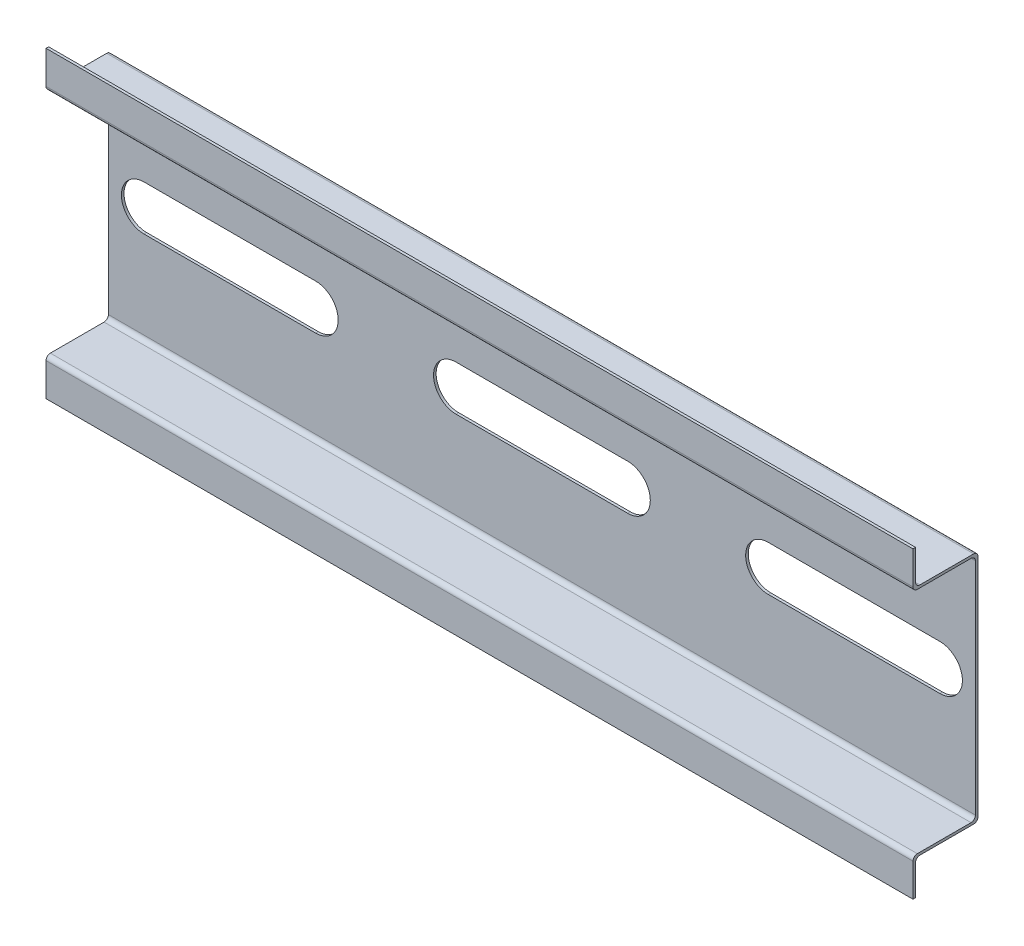
ISO-10303-21;
HEADER;
FILE_DESCRIPTION(('STEP AP214'),'2;1');
FILE_NAME('part.step','',(''),(''),'','','');
FILE_SCHEMA(('AUTOMOTIVE_DESIGN { 1 0 10303 214 1 1 1 1 }'));
ENDSEC;
DATA;
#1=APPLICATION_CONTEXT('core data for automotive mechanical design processes');
#2=APPLICATION_PROTOCOL_DEFINITION('international standard','automotive_design',2000,#1);
#3=PRODUCT_CONTEXT('',#1,'mechanical');
#4=PRODUCT('Part','Part','',(#3));
#5=PRODUCT_RELATED_PRODUCT_CATEGORY('part','',(#4));
#6=PRODUCT_DEFINITION_FORMATION('','',#4);
#7=PRODUCT_DEFINITION_CONTEXT('part definition',#1,'design');
#8=PRODUCT_DEFINITION('design','',#6,#7);
#9=PRODUCT_DEFINITION_SHAPE('','',#8);
#10=(LENGTH_UNIT() NAMED_UNIT(*) SI_UNIT(.MILLI.,.METRE.));
#11=(NAMED_UNIT(*) PLANE_ANGLE_UNIT() SI_UNIT($,.RADIAN.));
#12=(NAMED_UNIT(*) SI_UNIT($,.STERADIAN.) SOLID_ANGLE_UNIT());
#13=UNCERTAINTY_MEASURE_WITH_UNIT(LENGTH_MEASURE(1.E-05),#10,'distance_accuracy_value','');
#14=(GEOMETRIC_REPRESENTATION_CONTEXT(3) GLOBAL_UNCERTAINTY_ASSIGNED_CONTEXT((#13)) GLOBAL_UNIT_ASSIGNED_CONTEXT((#10,
#11,#12)) REPRESENTATION_CONTEXT('',''));
#15=CARTESIAN_POINT('',(0.,0.,0.));
#16=DIRECTION('',(0.,0.,1.));
#17=DIRECTION('',(1.,0.,0.));
#18=AXIS2_PLACEMENT_3D('',#15,#16,#17);
#19=CARTESIAN_POINT('',(100.,17.5,3.45));
#20=DIRECTION('',(0.,-1.,0.));
#21=DIRECTION('',(0.,0.,-1.));
#22=AXIS2_PLACEMENT_3D('',#19,#20,#21);
#23=PLANE('',#22);
#24=DIRECTION('',(0.,0.,1.));
#25=VECTOR('',#24,1.);
#26=CARTESIAN_POINT('',(0.,17.5,3.45));
#27=LINE('',#26,#25);
#28=CARTESIAN_POINT('',(0.,17.5,3.45));
#29=VERTEX_POINT('',#28);
#30=CARTESIAN_POINT('',(0.,17.5,3.75));
#31=VERTEX_POINT('',#30);
#32=EDGE_CURVE('E343',#29,#31,#27,.T.);
#33=ORIENTED_EDGE('',*,*,#32,.T.);
#34=DIRECTION('',(-1.,0.,0.));
#35=VECTOR('',#34,1.);
#36=CARTESIAN_POINT('',(100.,17.5,3.75));
#37=LINE('',#36,#35);
#38=CARTESIAN_POINT('',(100.,17.5,3.75));
#39=VERTEX_POINT('',#38);
#40=EDGE_CURVE('E11',#39,#31,#37,.T.);
#41=ORIENTED_EDGE('',*,*,#40,.F.);
#42=DIRECTION('',(0.,0.,1.));
#43=VECTOR('',#42,1.);
#44=CARTESIAN_POINT('',(100.,17.5,3.45));
#45=LINE('',#44,#43);
#46=CARTESIAN_POINT('',(100.,17.5,3.45));
#47=VERTEX_POINT('',#46);
#48=EDGE_CURVE('E344',#47,#39,#45,.T.);
#49=ORIENTED_EDGE('',*,*,#48,.F.);
#50=DIRECTION('',(-1.,0.,0.));
#51=VECTOR('',#50,1.);
#52=CARTESIAN_POINT('',(100.,17.5,3.45));
#53=LINE('',#52,#51);
#54=EDGE_CURVE('E386',#47,#29,#53,.T.);
#55=ORIENTED_EDGE('',*,*,#54,.T.);
#56=EDGE_LOOP('',(#33,#41,#49,#55));
#57=FACE_BOUND('',#56,.T.);
#58=ADVANCED_FACE('F33',(#57),#23,.F.);
#59=CARTESIAN_POINT('',(100.,17.5,3.75));
#60=DIRECTION('',(0.,0.,-1.));
#61=DIRECTION('',(0.,1.,0.));
#62=AXIS2_PLACEMENT_3D('',#59,#60,#61);
#63=PLANE('',#62);
#64=DIRECTION('',(0.,-1.,0.));
#65=VECTOR('',#64,1.);
#66=CARTESIAN_POINT('',(0.,17.5,3.75));
#67=LINE('',#66,#65);
#68=CARTESIAN_POINT('',(0.,13.7,3.75));
#69=VERTEX_POINT('',#68);
#70=EDGE_CURVE('E389',#31,#69,#67,.T.);
#71=ORIENTED_EDGE('',*,*,#70,.T.);
#72=DIRECTION('',(-1.,0.,0.));
#73=VECTOR('',#72,1.);
#74=CARTESIAN_POINT('',(100.,13.7,3.75));
#75=LINE('',#74,#73);
#76=CARTESIAN_POINT('',(100.,13.7,3.75));
#77=VERTEX_POINT('',#76);
#78=EDGE_CURVE('E40',#77,#69,#75,.T.);
#79=ORIENTED_EDGE('',*,*,#78,.F.);
#80=DIRECTION('',(0.,-1.,0.));
#81=VECTOR('',#80,1.);
#82=CARTESIAN_POINT('',(100.,17.5,3.75));
#83=LINE('',#82,#81);
#84=EDGE_CURVE('E347',#39,#77,#83,.T.);
#85=ORIENTED_EDGE('',*,*,#84,.F.);
#86=ORIENTED_EDGE('',*,*,#40,.T.);
#87=EDGE_LOOP('',(#71,#79,#85,#86));
#88=FACE_BOUND('',#87,.T.);
#89=ADVANCED_FACE('F506',(#88),#63,.F.);
#90=CARTESIAN_POINT('',(100.,13.7,3.25));
#91=DIRECTION('',(-1.,0.,0.));
#92=DIRECTION('',(0.,0.,1.));
#93=AXIS2_PLACEMENT_3D('',#90,#91,#92);
#94=CYLINDRICAL_SURFACE('',#93,0.5);
#95=CARTESIAN_POINT('',(0.,13.7,3.25));
#96=DIRECTION('',(1.,0.,0.));
#97=DIRECTION('',(0.,0.,-1.));
#98=AXIS2_PLACEMENT_3D('',#95,#96,#97);
#99=CIRCLE('',#98,0.5);
#100=CARTESIAN_POINT('',(0.,13.2,3.25));
#101=VERTEX_POINT('',#100);
#102=EDGE_CURVE('E391',#69,#101,#99,.T.);
#103=ORIENTED_EDGE('',*,*,#102,.T.);
#104=DIRECTION('',(-1.,0.,0.));
#105=VECTOR('',#104,1.);
#106=CARTESIAN_POINT('',(100.,13.2,3.25));
#107=LINE('',#106,#105);
#108=CARTESIAN_POINT('',(100.,13.2,3.25));
#109=VERTEX_POINT('',#108);
#110=EDGE_CURVE('E476',#109,#101,#107,.T.);
#111=ORIENTED_EDGE('',*,*,#110,.F.);
#112=CARTESIAN_POINT('',(100.,13.7,3.25));
#113=DIRECTION('',(1.,0.,0.));
#114=DIRECTION('',(0.,0.,-1.));
#115=AXIS2_PLACEMENT_3D('',#112,#113,#114);
#116=CIRCLE('',#115,0.5);
#117=EDGE_CURVE('E350',#77,#109,#116,.T.);
#118=ORIENTED_EDGE('',*,*,#117,.F.);
#119=ORIENTED_EDGE('',*,*,#78,.T.);
#120=EDGE_LOOP('',(#103,#111,#118,#119));
#121=FACE_BOUND('',#120,.T.);
#122=ADVANCED_FACE('F483',(#121),#94,.T.);
#123=CARTESIAN_POINT('',(100.,13.2,3.25));
#124=DIRECTION('',(0.,1.,0.));
#125=DIRECTION('',(0.,0.,1.));
#126=AXIS2_PLACEMENT_3D('',#123,#124,#125);
#127=PLANE('',#126);
#128=DIRECTION('',(0.,0.,-1.));
#129=VECTOR('',#128,1.);
#130=CARTESIAN_POINT('',(0.,13.2,3.25));
#131=LINE('',#130,#129);
#132=CARTESIAN_POINT('',(0.,13.2,-2.95));
#133=VERTEX_POINT('',#132);
#134=EDGE_CURVE('E393',#101,#133,#131,.T.);
#135=ORIENTED_EDGE('',*,*,#134,.T.);
#136=DIRECTION('',(-1.,0.,0.));
#137=VECTOR('',#136,1.);
#138=CARTESIAN_POINT('',(100.,13.2,-2.95));
#139=LINE('',#138,#137);
#140=CARTESIAN_POINT('',(100.,13.2,-2.95));
#141=VERTEX_POINT('',#140);
#142=EDGE_CURVE('E473',#141,#133,#139,.T.);
#143=ORIENTED_EDGE('',*,*,#142,.F.);
#144=DIRECTION('',(0.,0.,-1.));
#145=VECTOR('',#144,1.);
#146=CARTESIAN_POINT('',(100.,13.2,3.25));
#147=LINE('',#146,#145);
#148=EDGE_CURVE('E352',#109,#141,#147,.T.);
#149=ORIENTED_EDGE('',*,*,#148,.F.);
#150=ORIENTED_EDGE('',*,*,#110,.T.);
#151=EDGE_LOOP('',(#135,#143,#149,#150));
#152=FACE_BOUND('',#151,.T.);
#153=ADVANCED_FACE('F494',(#152),#127,.F.);
#154=CARTESIAN_POINT('',(100.,12.7,-2.95));
#155=DIRECTION('',(-1.,0.,0.));
#156=DIRECTION('',(0.,0.,1.));
#157=AXIS2_PLACEMENT_3D('',#154,#155,#156);
#158=CYLINDRICAL_SURFACE('',#157,0.500000000000001);
#159=CARTESIAN_POINT('',(0.,12.7,-2.95));
#160=DIRECTION('',(-1.,0.,0.));
#161=DIRECTION('',(0.,0.,1.));
#162=AXIS2_PLACEMENT_3D('',#159,#160,#161);
#163=CIRCLE('',#162,0.500000000000001);
#164=CARTESIAN_POINT('',(0.,12.7,-3.45000000000001));
#165=VERTEX_POINT('',#164);
#166=EDGE_CURVE('E395',#133,#165,#163,.T.);
#167=ORIENTED_EDGE('',*,*,#166,.T.);
#168=DIRECTION('',(-1.,0.,0.));
#169=VECTOR('',#168,1.);
#170=CARTESIAN_POINT('',(100.,12.7,-3.45000000000001));
#171=LINE('',#170,#169);
#172=CARTESIAN_POINT('',(100.,12.7,-3.45000000000001));
#173=VERTEX_POINT('',#172);
#174=EDGE_CURVE('E470',#173,#165,#171,.T.);
#175=ORIENTED_EDGE('',*,*,#174,.F.);
#176=CARTESIAN_POINT('',(100.,12.7,-2.95));
#177=DIRECTION('',(-1.,0.,0.));
#178=DIRECTION('',(0.,0.,1.));
#179=AXIS2_PLACEMENT_3D('',#176,#177,#178);
#180=CIRCLE('',#179,0.500000000000001);
#181=EDGE_CURVE('E354',#141,#173,#180,.T.);
#182=ORIENTED_EDGE('',*,*,#181,.F.);
#183=ORIENTED_EDGE('',*,*,#142,.T.);
#184=EDGE_LOOP('',(#167,#175,#182,#183));
#185=FACE_BOUND('',#184,.T.);
#186=ADVANCED_FACE('F498',(#185),#158,.F.);
#187=CARTESIAN_POINT('',(100.,12.7,-3.45));
#188=DIRECTION('',(0.,0.,-1.));
#189=DIRECTION('',(0.,1.,0.));
#190=AXIS2_PLACEMENT_3D('',#187,#188,#189);
#191=PLANE('',#190);
#192=DIRECTION('',(1.,0.,0.));
#193=VECTOR('',#192,1.);
#194=CARTESIAN_POINT('',(100.,2.59999999999999,-3.45000000000001));
#195=LINE('',#194,#193);
#196=CARTESIAN_POINT('',(40.1,2.6,-3.45000000000001));
#197=VERTEX_POINT('',#196);
#198=CARTESIAN_POINT('',(59.9,2.6,-3.45000000000001));
#199=VERTEX_POINT('',#198);
#200=EDGE_CURVE('E305',#197,#199,#195,.T.);
#201=ORIENTED_EDGE('',*,*,#200,.T.);
#202=CARTESIAN_POINT('',(59.9,0.,-3.45000000000001));
#203=DIRECTION('',(0.,0.,-1.));
#204=DIRECTION('',(0.,1.,0.));
#205=AXIS2_PLACEMENT_3D('',#202,#203,#204);
#206=CIRCLE('',#205,2.6);
#207=CARTESIAN_POINT('',(59.9,-2.59999999999999,-3.45000000000001));
#208=VERTEX_POINT('',#207);
#209=EDGE_CURVE('E308',#199,#208,#206,.T.);
#210=ORIENTED_EDGE('',*,*,#209,.T.);
#211=DIRECTION('',(-1.,0.,0.));
#212=VECTOR('',#211,1.);
#213=CARTESIAN_POINT('',(100.,-2.6,-3.45000000000001));
#214=LINE('',#213,#212);
#215=CARTESIAN_POINT('',(40.1,-2.59999999999999,-3.45000000000001));
#216=VERTEX_POINT('',#215);
#217=EDGE_CURVE('E302',#208,#216,#214,.T.);
#218=ORIENTED_EDGE('',*,*,#217,.T.);
#219=CARTESIAN_POINT('',(40.1,0.,-3.45000000000001));
#220=DIRECTION('',(0.,0.,-1.));
#221=DIRECTION('',(0.,1.,0.));
#222=AXIS2_PLACEMENT_3D('',#219,#220,#221);
#223=CIRCLE('',#222,2.6);
#224=EDGE_CURVE('E246',#216,#197,#223,.T.);
#225=ORIENTED_EDGE('',*,*,#224,.T.);
#226=EDGE_LOOP('',(#201,#210,#218,#225));
#227=FACE_BOUND('',#226,.T.);
#228=DIRECTION('',(1.,0.,0.));
#229=VECTOR('',#228,1.);
#230=CARTESIAN_POINT('',(100.,2.6,-3.45000000000001));
#231=LINE('',#230,#229);
#232=CARTESIAN_POINT('',(4.09999999999999,2.6,-3.45000000000001));
#233=VERTEX_POINT('',#232);
#234=CARTESIAN_POINT('',(23.9,2.6,-3.45000000000001));
#235=VERTEX_POINT('',#234);
#236=EDGE_CURVE('E296',#233,#235,#231,.T.);
#237=ORIENTED_EDGE('',*,*,#236,.T.);
#238=CARTESIAN_POINT('',(23.9,0.,-3.45000000000001));
#239=DIRECTION('',(0.,0.,-1.));
#240=DIRECTION('',(0.,1.,0.));
#241=AXIS2_PLACEMENT_3D('',#238,#239,#240);
#242=CIRCLE('',#241,2.6);
#243=CARTESIAN_POINT('',(23.9,-2.6,-3.45000000000001));
#244=VERTEX_POINT('',#243);
#245=EDGE_CURVE('E299',#235,#244,#242,.T.);
#246=ORIENTED_EDGE('',*,*,#245,.T.);
#247=DIRECTION('',(-1.,0.,0.));
#248=VECTOR('',#247,1.);
#249=CARTESIAN_POINT('',(100.,-2.6,-3.45000000000001));
#250=LINE('',#249,#248);
#251=CARTESIAN_POINT('',(4.09999999999999,-2.6,-3.45000000000001));
#252=VERTEX_POINT('',#251);
#253=EDGE_CURVE('E270',#244,#252,#250,.T.);
#254=ORIENTED_EDGE('',*,*,#253,.T.);
#255=CARTESIAN_POINT('',(4.09999999999999,0.,-3.45000000000001));
#256=DIRECTION('',(0.,0.,-1.));
#257=DIRECTION('',(0.,1.,0.));
#258=AXIS2_PLACEMENT_3D('',#255,#256,#257);
#259=CIRCLE('',#258,2.6);
#260=EDGE_CURVE('E293',#252,#233,#259,.T.);
#261=ORIENTED_EDGE('',*,*,#260,.T.);
#262=EDGE_LOOP('',(#237,#246,#254,#261));
#263=FACE_BOUND('',#262,.T.);
#264=DIRECTION('',(1.,0.,0.));
#265=VECTOR('',#264,1.);
#266=CARTESIAN_POINT('',(100.,2.6,-3.45000000000001));
#267=LINE('',#266,#265);
#268=CARTESIAN_POINT('',(76.1,2.6,-3.45000000000001));
#269=VERTEX_POINT('',#268);
#270=CARTESIAN_POINT('',(95.9,2.6,-3.45000000000001));
#271=VERTEX_POINT('',#270);
#272=EDGE_CURVE('E337',#269,#271,#267,.T.);
#273=ORIENTED_EDGE('',*,*,#272,.T.);
#274=CARTESIAN_POINT('',(95.9,0.,-3.45000000000001));
#275=DIRECTION('',(0.,0.,-1.));
#276=DIRECTION('',(0.,1.,0.));
#277=AXIS2_PLACEMENT_3D('',#274,#275,#276);
#278=CIRCLE('',#277,2.6);
#279=CARTESIAN_POINT('',(95.9,-2.6,-3.45000000000001));
#280=VERTEX_POINT('',#279);
#281=EDGE_CURVE('E340',#271,#280,#278,.T.);
#282=ORIENTED_EDGE('',*,*,#281,.T.);
#283=DIRECTION('',(-1.,0.,0.));
#284=VECTOR('',#283,1.);
#285=CARTESIAN_POINT('',(100.,-2.6,-3.45000000000001));
#286=LINE('',#285,#284);
#287=CARTESIAN_POINT('',(76.1,-2.6,-3.45000000000001));
#288=VERTEX_POINT('',#287);
#289=EDGE_CURVE('E325',#280,#288,#286,.T.);
#290=ORIENTED_EDGE('',*,*,#289,.T.);
#291=CARTESIAN_POINT('',(76.1,0.,-3.45000000000001));
#292=DIRECTION('',(0.,0.,-1.));
#293=DIRECTION('',(0.,1.,0.));
#294=AXIS2_PLACEMENT_3D('',#291,#292,#293);
#295=CIRCLE('',#294,2.6);
#296=EDGE_CURVE('E334',#288,#269,#295,.T.);
#297=ORIENTED_EDGE('',*,*,#296,.T.);
#298=EDGE_LOOP('',(#273,#282,#290,#297));
#299=FACE_BOUND('',#298,.T.);
#300=DIRECTION('',(0.,-1.,0.));
#301=VECTOR('',#300,1.);
#302=CARTESIAN_POINT('',(0.,12.7,-3.45));
#303=LINE('',#302,#301);
#304=CARTESIAN_POINT('',(0.,-12.7,-3.45000000000001));
#305=VERTEX_POINT('',#304);
#306=EDGE_CURVE('E397',#165,#305,#303,.T.);
#307=ORIENTED_EDGE('',*,*,#306,.T.);
#308=DIRECTION('',(-1.,0.,0.));
#309=VECTOR('',#308,1.);
#310=CARTESIAN_POINT('',(100.,-12.7,-3.45000000000001));
#311=LINE('',#310,#309);
#312=CARTESIAN_POINT('',(100.,-12.7,-3.45000000000001));
#313=VERTEX_POINT('',#312);
#314=EDGE_CURVE('E467',#313,#305,#311,.T.);
#315=ORIENTED_EDGE('',*,*,#314,.F.);
#316=DIRECTION('',(0.,-1.,0.));
#317=VECTOR('',#316,1.);
#318=CARTESIAN_POINT('',(100.,12.7,-3.45));
#319=LINE('',#318,#317);
#320=EDGE_CURVE('E356',#173,#313,#319,.T.);
#321=ORIENTED_EDGE('',*,*,#320,.F.);
#322=ORIENTED_EDGE('',*,*,#174,.T.);
#323=EDGE_LOOP('',(#307,#315,#321,#322));
#324=FACE_BOUND('',#323,.T.);
#325=ADVANCED_FACE('F578',(#227,#263,#299,#324),#191,.F.);
#326=CARTESIAN_POINT('',(100.,-12.7,-2.95000000000001));
#327=DIRECTION('',(-1.,0.,0.));
#328=DIRECTION('',(0.,0.,1.));
#329=AXIS2_PLACEMENT_3D('',#326,#327,#328);
#330=CYLINDRICAL_SURFACE('',#329,0.500000000000001);
#331=CARTESIAN_POINT('',(0.,-12.7,-2.95000000000001));
#332=DIRECTION('',(-1.,0.,0.));
#333=DIRECTION('',(0.,0.,1.));
#334=AXIS2_PLACEMENT_3D('',#331,#332,#333);
#335=CIRCLE('',#334,0.500000000000001);
#336=CARTESIAN_POINT('',(0.,-13.2,-2.95000000000001));
#337=VERTEX_POINT('',#336);
#338=EDGE_CURVE('E399',#305,#337,#335,.T.);
#339=ORIENTED_EDGE('',*,*,#338,.T.);
#340=DIRECTION('',(-1.,0.,0.));
#341=VECTOR('',#340,1.);
#342=CARTESIAN_POINT('',(100.,-13.2,-2.95000000000001));
#343=LINE('',#342,#341);
#344=CARTESIAN_POINT('',(100.,-13.2,-2.95000000000001));
#345=VERTEX_POINT('',#344);
#346=EDGE_CURVE('E464',#345,#337,#343,.T.);
#347=ORIENTED_EDGE('',*,*,#346,.F.);
#348=CARTESIAN_POINT('',(100.,-12.7,-2.95000000000001));
#349=DIRECTION('',(-1.,0.,0.));
#350=DIRECTION('',(0.,0.,1.));
#351=AXIS2_PLACEMENT_3D('',#348,#349,#350);
#352=CIRCLE('',#351,0.500000000000001);
#353=EDGE_CURVE('E358',#313,#345,#352,.T.);
#354=ORIENTED_EDGE('',*,*,#353,.F.);
#355=ORIENTED_EDGE('',*,*,#314,.T.);
#356=EDGE_LOOP('',(#339,#347,#354,#355));
#357=FACE_BOUND('',#356,.T.);
#358=ADVANCED_FACE('F576',(#357),#330,.F.);
#359=CARTESIAN_POINT('',(100.,-13.2,-2.95000000000001));
#360=DIRECTION('',(0.,-1.,0.));
#361=DIRECTION('',(0.,0.,-1.));
#362=AXIS2_PLACEMENT_3D('',#359,#360,#361);
#363=PLANE('',#362);
#364=DIRECTION('',(0.,0.,1.));
#365=VECTOR('',#364,1.);
#366=CARTESIAN_POINT('',(0.,-13.2,-2.95000000000001));
#367=LINE('',#366,#365);
#368=CARTESIAN_POINT('',(0.,-13.2,3.25));
#369=VERTEX_POINT('',#368);
#370=EDGE_CURVE('E401',#337,#369,#367,.T.);
#371=ORIENTED_EDGE('',*,*,#370,.T.);
#372=DIRECTION('',(-1.,0.,0.));
#373=VECTOR('',#372,1.);
#374=CARTESIAN_POINT('',(100.,-13.2,3.25));
#375=LINE('',#374,#373);
#376=CARTESIAN_POINT('',(100.,-13.2,3.25));
#377=VERTEX_POINT('',#376);
#378=EDGE_CURVE('E461',#377,#369,#375,.T.);
#379=ORIENTED_EDGE('',*,*,#378,.F.);
#380=DIRECTION('',(0.,0.,1.));
#381=VECTOR('',#380,1.);
#382=CARTESIAN_POINT('',(100.,-13.2,-2.95000000000001));
#383=LINE('',#382,#381);
#384=EDGE_CURVE('E360',#345,#377,#383,.T.);
#385=ORIENTED_EDGE('',*,*,#384,.F.);
#386=ORIENTED_EDGE('',*,*,#346,.T.);
#387=EDGE_LOOP('',(#371,#379,#385,#386));
#388=FACE_BOUND('',#387,.T.);
#389=ADVANCED_FACE('F571',(#388),#363,.F.);
#390=CARTESIAN_POINT('',(100.,-13.7,3.25));
#391=DIRECTION('',(-1.,0.,0.));
#392=DIRECTION('',(0.,0.,1.));
#393=AXIS2_PLACEMENT_3D('',#390,#391,#392);
#394=CYLINDRICAL_SURFACE('',#393,0.5);
#395=CARTESIAN_POINT('',(0.,-13.7,3.25));
#396=DIRECTION('',(1.,0.,0.));
#397=DIRECTION('',(0.,0.,-1.));
#398=AXIS2_PLACEMENT_3D('',#395,#396,#397);
#399=CIRCLE('',#398,0.5);
#400=CARTESIAN_POINT('',(0.,-13.7,3.75));
#401=VERTEX_POINT('',#400);
#402=EDGE_CURVE('E403',#369,#401,#399,.T.);
#403=ORIENTED_EDGE('',*,*,#402,.T.);
#404=DIRECTION('',(-1.,0.,0.));
#405=VECTOR('',#404,1.);
#406=CARTESIAN_POINT('',(100.,-13.7,3.75));
#407=LINE('',#406,#405);
#408=CARTESIAN_POINT('',(100.,-13.7,3.75));
#409=VERTEX_POINT('',#408);
#410=EDGE_CURVE('E458',#409,#401,#407,.T.);
#411=ORIENTED_EDGE('',*,*,#410,.F.);
#412=CARTESIAN_POINT('',(100.,-13.7,3.25));
#413=DIRECTION('',(1.,0.,0.));
#414=DIRECTION('',(0.,0.,-1.));
#415=AXIS2_PLACEMENT_3D('',#412,#413,#414);
#416=CIRCLE('',#415,0.5);
#417=EDGE_CURVE('E362',#377,#409,#416,.T.);
#418=ORIENTED_EDGE('',*,*,#417,.F.);
#419=ORIENTED_EDGE('',*,*,#378,.T.);
#420=EDGE_LOOP('',(#403,#411,#418,#419));
#421=FACE_BOUND('',#420,.T.);
#422=ADVANCED_FACE('F566',(#421),#394,.T.);
#423=CARTESIAN_POINT('',(100.,-13.7,3.75));
#424=DIRECTION('',(0.,0.,-1.));
#425=DIRECTION('',(0.,1.,0.));
#426=AXIS2_PLACEMENT_3D('',#423,#424,#425);
#427=PLANE('',#426);
#428=DIRECTION('',(0.,-1.,0.));
#429=VECTOR('',#428,1.);
#430=CARTESIAN_POINT('',(0.,-13.7,3.75));
#431=LINE('',#430,#429);
#432=CARTESIAN_POINT('',(0.,-17.5,3.75));
#433=VERTEX_POINT('',#432);
#434=EDGE_CURVE('E405',#401,#433,#431,.T.);
#435=ORIENTED_EDGE('',*,*,#434,.T.);
#436=DIRECTION('',(-1.,0.,0.));
#437=VECTOR('',#436,1.);
#438=CARTESIAN_POINT('',(100.,-17.5,3.75));
#439=LINE('',#438,#437);
#440=CARTESIAN_POINT('',(100.,-17.5,3.75));
#441=VERTEX_POINT('',#440);
#442=EDGE_CURVE('E455',#441,#433,#439,.T.);
#443=ORIENTED_EDGE('',*,*,#442,.F.);
#444=DIRECTION('',(0.,-1.,0.));
#445=VECTOR('',#444,1.);
#446=CARTESIAN_POINT('',(100.,-13.7,3.75));
#447=LINE('',#446,#445);
#448=EDGE_CURVE('E364',#409,#441,#447,.T.);
#449=ORIENTED_EDGE('',*,*,#448,.F.);
#450=ORIENTED_EDGE('',*,*,#410,.T.);
#451=EDGE_LOOP('',(#435,#443,#449,#450));
#452=FACE_BOUND('',#451,.T.);
#453=ADVANCED_FACE('F562',(#452),#427,.F.);
#454=CARTESIAN_POINT('',(100.,-17.5,3.75));
#455=DIRECTION('',(0.,1.,0.));
#456=DIRECTION('',(0.,0.,1.));
#457=AXIS2_PLACEMENT_3D('',#454,#455,#456);
#458=PLANE('',#457);
#459=DIRECTION('',(0.,0.,-1.));
#460=VECTOR('',#459,1.);
#461=CARTESIAN_POINT('',(0.,-17.5,3.75));
#462=LINE('',#461,#460);
#463=CARTESIAN_POINT('',(0.,-17.5,3.45));
#464=VERTEX_POINT('',#463);
#465=EDGE_CURVE('E407',#433,#464,#462,.T.);
#466=ORIENTED_EDGE('',*,*,#465,.T.);
#467=DIRECTION('',(-1.,0.,0.));
#468=VECTOR('',#467,1.);
#469=CARTESIAN_POINT('',(100.,-17.5,3.45));
#470=LINE('',#469,#468);
#471=CARTESIAN_POINT('',(100.,-17.5,3.45));
#472=VERTEX_POINT('',#471);
#473=EDGE_CURVE('E452',#472,#464,#470,.T.);
#474=ORIENTED_EDGE('',*,*,#473,.F.);
#475=DIRECTION('',(0.,0.,-1.));
#476=VECTOR('',#475,1.);
#477=CARTESIAN_POINT('',(100.,-17.5,3.75));
#478=LINE('',#477,#476);
#479=EDGE_CURVE('E366',#441,#472,#478,.T.);
#480=ORIENTED_EDGE('',*,*,#479,.F.);
#481=ORIENTED_EDGE('',*,*,#442,.T.);
#482=EDGE_LOOP('',(#466,#474,#480,#481));
#483=FACE_BOUND('',#482,.T.);
#484=ADVANCED_FACE('F557',(#483),#458,.F.);
#485=CARTESIAN_POINT('',(100.,-17.5,3.45));
#486=DIRECTION('',(0.,0.,1.));
#487=DIRECTION('',(0.,-1.,0.));
#488=AXIS2_PLACEMENT_3D('',#485,#486,#487);
#489=PLANE('',#488);
#490=DIRECTION('',(0.,1.,0.));
#491=VECTOR('',#490,1.);
#492=CARTESIAN_POINT('',(0.,-17.5,3.45));
#493=LINE('',#492,#491);
#494=CARTESIAN_POINT('',(0.,-14.,3.45));
#495=VERTEX_POINT('',#494);
#496=EDGE_CURVE('E409',#464,#495,#493,.T.);
#497=ORIENTED_EDGE('',*,*,#496,.T.);
#498=DIRECTION('',(-1.,0.,0.));
#499=VECTOR('',#498,1.);
#500=CARTESIAN_POINT('',(100.,-14.,3.45));
#501=LINE('',#500,#499);
#502=CARTESIAN_POINT('',(100.,-14.,3.45));
#503=VERTEX_POINT('',#502);
#504=EDGE_CURVE('E449',#503,#495,#501,.T.);
#505=ORIENTED_EDGE('',*,*,#504,.F.);
#506=DIRECTION('',(0.,1.,0.));
#507=VECTOR('',#506,1.);
#508=CARTESIAN_POINT('',(100.,-17.5,3.45));
#509=LINE('',#508,#507);
#510=EDGE_CURVE('E368',#472,#503,#509,.T.);
#511=ORIENTED_EDGE('',*,*,#510,.F.);
#512=ORIENTED_EDGE('',*,*,#473,.T.);
#513=EDGE_LOOP('',(#497,#505,#511,#512));
#514=FACE_BOUND('',#513,.T.);
#515=ADVANCED_FACE('F551',(#514),#489,.F.);
#516=CARTESIAN_POINT('',(100.,-14.,2.95));
#517=DIRECTION('',(-1.,0.,0.));
#518=DIRECTION('',(0.,0.,1.));
#519=AXIS2_PLACEMENT_3D('',#516,#517,#518);
#520=CYLINDRICAL_SURFACE('',#519,0.5);
#521=CARTESIAN_POINT('',(0.,-14.,2.95));
#522=DIRECTION('',(-1.,0.,0.));
#523=DIRECTION('',(0.,0.,1.));
#524=AXIS2_PLACEMENT_3D('',#521,#522,#523);
#525=CIRCLE('',#524,0.5);
#526=CARTESIAN_POINT('',(0.,-13.5,2.95));
#527=VERTEX_POINT('',#526);
#528=EDGE_CURVE('E411',#495,#527,#525,.T.);
#529=ORIENTED_EDGE('',*,*,#528,.T.);
#530=DIRECTION('',(-1.,0.,0.));
#531=VECTOR('',#530,1.);
#532=CARTESIAN_POINT('',(100.,-13.5,2.95));
#533=LINE('',#532,#531);
#534=CARTESIAN_POINT('',(100.,-13.5,2.95));
#535=VERTEX_POINT('',#534);
#536=EDGE_CURVE('E446',#535,#527,#533,.T.);
#537=ORIENTED_EDGE('',*,*,#536,.F.);
#538=CARTESIAN_POINT('',(100.,-14.,2.95));
#539=DIRECTION('',(-1.,0.,0.));
#540=DIRECTION('',(0.,0.,1.));
#541=AXIS2_PLACEMENT_3D('',#538,#539,#540);
#542=CIRCLE('',#541,0.5);
#543=EDGE_CURVE('E370',#503,#535,#542,.T.);
#544=ORIENTED_EDGE('',*,*,#543,.F.);
#545=ORIENTED_EDGE('',*,*,#504,.T.);
#546=EDGE_LOOP('',(#529,#537,#544,#545));
#547=FACE_BOUND('',#546,.T.);
#548=ADVANCED_FACE('F547',(#547),#520,.F.);
#549=CARTESIAN_POINT('',(100.,-13.5,2.95));
#550=DIRECTION('',(0.,1.,0.));
#551=DIRECTION('',(0.,0.,1.));
#552=AXIS2_PLACEMENT_3D('',#549,#550,#551);
#553=PLANE('',#552);
#554=DIRECTION('',(0.,0.,-1.));
#555=VECTOR('',#554,1.);
#556=CARTESIAN_POINT('',(0.,-13.5,2.95));
#557=LINE('',#556,#555);
#558=CARTESIAN_POINT('',(0.,-13.5,-3.25000000000001));
#559=VERTEX_POINT('',#558);
#560=EDGE_CURVE('E413',#527,#559,#557,.T.);
#561=ORIENTED_EDGE('',*,*,#560,.T.);
#562=DIRECTION('',(-1.,0.,0.));
#563=VECTOR('',#562,1.);
#564=CARTESIAN_POINT('',(100.,-13.5,-3.25000000000001));
#565=LINE('',#564,#563);
#566=CARTESIAN_POINT('',(100.,-13.5,-3.25000000000001));
#567=VERTEX_POINT('',#566);
#568=EDGE_CURVE('E443',#567,#559,#565,.T.);
#569=ORIENTED_EDGE('',*,*,#568,.F.);
#570=DIRECTION('',(0.,0.,-1.));
#571=VECTOR('',#570,1.);
#572=CARTESIAN_POINT('',(100.,-13.5,2.95));
#573=LINE('',#572,#571);
#574=EDGE_CURVE('E372',#535,#567,#573,.T.);
#575=ORIENTED_EDGE('',*,*,#574,.F.);
#576=ORIENTED_EDGE('',*,*,#536,.T.);
#577=EDGE_LOOP('',(#561,#569,#575,#576));
#578=FACE_BOUND('',#577,.T.);
#579=ADVANCED_FACE('F542',(#578),#553,.F.);
#580=CARTESIAN_POINT('',(100.,-13.,-3.25000000000001));
#581=DIRECTION('',(-1.,0.,0.));
#582=DIRECTION('',(0.,0.,1.));
#583=AXIS2_PLACEMENT_3D('',#580,#581,#582);
#584=CYLINDRICAL_SURFACE('',#583,0.5);
#585=CARTESIAN_POINT('',(0.,-13.,-3.25000000000001));
#586=DIRECTION('',(1.,0.,0.));
#587=DIRECTION('',(0.,0.,-1.));
#588=AXIS2_PLACEMENT_3D('',#585,#586,#587);
#589=CIRCLE('',#588,0.5);
#590=CARTESIAN_POINT('',(0.,-13.,-3.75000000000001));
#591=VERTEX_POINT('',#590);
#592=EDGE_CURVE('E415',#559,#591,#589,.T.);
#593=ORIENTED_EDGE('',*,*,#592,.T.);
#594=DIRECTION('',(-1.,0.,0.));
#595=VECTOR('',#594,1.);
#596=CARTESIAN_POINT('',(100.,-13.,-3.75000000000001));
#597=LINE('',#596,#595);
#598=CARTESIAN_POINT('',(100.,-13.,-3.75000000000001));
#599=VERTEX_POINT('',#598);
#600=EDGE_CURVE('E440',#599,#591,#597,.T.);
#601=ORIENTED_EDGE('',*,*,#600,.F.);
#602=CARTESIAN_POINT('',(100.,-13.,-3.25000000000001));
#603=DIRECTION('',(1.,0.,0.));
#604=DIRECTION('',(0.,0.,-1.));
#605=AXIS2_PLACEMENT_3D('',#602,#603,#604);
#606=CIRCLE('',#605,0.5);
#607=EDGE_CURVE('E374',#567,#599,#606,.T.);
#608=ORIENTED_EDGE('',*,*,#607,.F.);
#609=ORIENTED_EDGE('',*,*,#568,.T.);
#610=EDGE_LOOP('',(#593,#601,#608,#609));
#611=FACE_BOUND('',#610,.T.);
#612=ADVANCED_FACE('F536',(#611),#584,.T.);
#613=CARTESIAN_POINT('',(100.,-13.,-3.75000000000001));
#614=DIRECTION('',(0.,0.,1.));
#615=DIRECTION('',(0.,-1.,0.));
#616=AXIS2_PLACEMENT_3D('',#613,#614,#615);
#617=PLANE('',#616);
#618=DIRECTION('',(-1.,0.,0.));
#619=VECTOR('',#618,1.);
#620=CARTESIAN_POINT('',(59.9,-2.59999999999999,-3.75000000000001));
#621=LINE('',#620,#619);
#622=CARTESIAN_POINT('',(59.9,-2.59999999999999,-3.75000000000001));
#623=VERTEX_POINT('',#622);
#624=CARTESIAN_POINT('',(40.1,-2.6,-3.75000000000001));
#625=VERTEX_POINT('',#624);
#626=EDGE_CURVE('E253',#623,#625,#621,.T.);
#627=ORIENTED_EDGE('',*,*,#626,.F.);
#628=CARTESIAN_POINT('',(59.9,0.,-3.75000000000001));
#629=DIRECTION('',(0.,0.,-1.));
#630=DIRECTION('',(0.,1.,0.));
#631=AXIS2_PLACEMENT_3D('',#628,#629,#630);
#632=CIRCLE('',#631,2.6);
#633=CARTESIAN_POINT('',(59.9,2.6,-3.75));
#634=VERTEX_POINT('',#633);
#635=EDGE_CURVE('E258',#634,#623,#632,.T.);
#636=ORIENTED_EDGE('',*,*,#635,.F.);
#637=DIRECTION('',(1.,0.,0.));
#638=VECTOR('',#637,1.);
#639=CARTESIAN_POINT('',(59.9,2.6,-3.75));
#640=LINE('',#639,#638);
#641=CARTESIAN_POINT('',(40.1,2.6,-3.75));
#642=VERTEX_POINT('',#641);
#643=EDGE_CURVE('E263',#642,#634,#640,.T.);
#644=ORIENTED_EDGE('',*,*,#643,.F.);
#645=CARTESIAN_POINT('',(40.1,0.,-3.75000000000001));
#646=DIRECTION('',(0.,0.,-1.));
#647=DIRECTION('',(0.,1.,0.));
#648=AXIS2_PLACEMENT_3D('',#645,#646,#647);
#649=CIRCLE('',#648,2.6);
#650=EDGE_CURVE('E243',#625,#642,#649,.T.);
#651=ORIENTED_EDGE('',*,*,#650,.F.);
#652=EDGE_LOOP('',(#627,#636,#644,#651));
#653=FACE_BOUND('',#652,.T.);
#654=DIRECTION('',(-1.,0.,0.));
#655=VECTOR('',#654,1.);
#656=CARTESIAN_POINT('',(23.9,-2.6,-3.75000000000001));
#657=LINE('',#656,#655);
#658=CARTESIAN_POINT('',(23.9,-2.6,-3.75000000000001));
#659=VERTEX_POINT('',#658);
#660=CARTESIAN_POINT('',(4.09999999999999,-2.6,-3.75000000000001));
#661=VERTEX_POINT('',#660);
#662=EDGE_CURVE('E275',#659,#661,#657,.T.);
#663=ORIENTED_EDGE('',*,*,#662,.F.);
#664=CARTESIAN_POINT('',(23.9,0.,-3.75000000000001));
#665=DIRECTION('',(0.,0.,-1.));
#666=DIRECTION('',(0.,1.,0.));
#667=AXIS2_PLACEMENT_3D('',#664,#665,#666);
#668=CIRCLE('',#667,2.6);
#669=CARTESIAN_POINT('',(23.9,2.6,-3.75));
#670=VERTEX_POINT('',#669);
#671=EDGE_CURVE('E273',#670,#659,#668,.T.);
#672=ORIENTED_EDGE('',*,*,#671,.F.);
#673=DIRECTION('',(1.,0.,0.));
#674=VECTOR('',#673,1.);
#675=CARTESIAN_POINT('',(23.9,2.6,-3.75));
#676=LINE('',#675,#674);
#677=CARTESIAN_POINT('',(4.09999999999999,2.6,-3.75));
#678=VERTEX_POINT('',#677);
#679=EDGE_CURVE('E280',#678,#670,#676,.T.);
#680=ORIENTED_EDGE('',*,*,#679,.F.);
#681=CARTESIAN_POINT('',(4.09999999999999,0.,-3.75000000000001));
#682=DIRECTION('',(0.,0.,-1.));
#683=DIRECTION('',(0.,1.,0.));
#684=AXIS2_PLACEMENT_3D('',#681,#682,#683);
#685=CIRCLE('',#684,2.6);
#686=EDGE_CURVE('E277',#661,#678,#685,.T.);
#687=ORIENTED_EDGE('',*,*,#686,.F.);
#688=EDGE_LOOP('',(#663,#672,#680,#687));
#689=FACE_BOUND('',#688,.T.);
#690=DIRECTION('',(-1.,0.,0.));
#691=VECTOR('',#690,1.);
#692=CARTESIAN_POINT('',(95.9,-2.6,-3.75000000000001));
#693=LINE('',#692,#691);
#694=CARTESIAN_POINT('',(95.9,-2.6,-3.75000000000001));
#695=VERTEX_POINT('',#694);
#696=CARTESIAN_POINT('',(76.1,-2.6,-3.75000000000001));
#697=VERTEX_POINT('',#696);
#698=EDGE_CURVE('E313',#695,#697,#693,.T.);
#699=ORIENTED_EDGE('',*,*,#698,.F.);
#700=CARTESIAN_POINT('',(95.9,0.,-3.75000000000001));
#701=DIRECTION('',(0.,0.,-1.));
#702=DIRECTION('',(0.,1.,0.));
#703=AXIS2_PLACEMENT_3D('',#700,#701,#702);
#704=CIRCLE('',#703,2.6);
#705=CARTESIAN_POINT('',(95.9,2.6,-3.75));
#706=VERTEX_POINT('',#705);
#707=EDGE_CURVE('E311',#706,#695,#704,.T.);
#708=ORIENTED_EDGE('',*,*,#707,.F.);
#709=DIRECTION('',(1.,0.,0.));
#710=VECTOR('',#709,1.);
#711=CARTESIAN_POINT('',(95.9,2.6,-3.75));
#712=LINE('',#711,#710);
#713=CARTESIAN_POINT('',(76.1,2.6,-3.75));
#714=VERTEX_POINT('',#713);
#715=EDGE_CURVE('E319',#714,#706,#712,.T.);
#716=ORIENTED_EDGE('',*,*,#715,.F.);
#717=CARTESIAN_POINT('',(76.1,0.,-3.75000000000001));
#718=DIRECTION('',(0.,0.,-1.));
#719=DIRECTION('',(0.,1.,0.));
#720=AXIS2_PLACEMENT_3D('',#717,#718,#719);
#721=CIRCLE('',#720,2.6);
#722=EDGE_CURVE('E316',#697,#714,#721,.T.);
#723=ORIENTED_EDGE('',*,*,#722,.F.);
#724=EDGE_LOOP('',(#699,#708,#716,#723));
#725=FACE_BOUND('',#724,.T.);
#726=DIRECTION('',(0.,1.,0.));
#727=VECTOR('',#726,1.);
#728=CARTESIAN_POINT('',(0.,-13.,-3.75000000000001));
#729=LINE('',#728,#727);
#730=CARTESIAN_POINT('',(0.,13.,-3.75));
#731=VERTEX_POINT('',#730);
#732=EDGE_CURVE('E417',#591,#731,#729,.T.);
#733=ORIENTED_EDGE('',*,*,#732,.T.);
#734=DIRECTION('',(-1.,0.,0.));
#735=VECTOR('',#734,1.);
#736=CARTESIAN_POINT('',(100.,13.,-3.75));
#737=LINE('',#736,#735);
#738=CARTESIAN_POINT('',(100.,13.,-3.75));
#739=VERTEX_POINT('',#738);
#740=EDGE_CURVE('E437',#739,#731,#737,.T.);
#741=ORIENTED_EDGE('',*,*,#740,.F.);
#742=DIRECTION('',(0.,1.,0.));
#743=VECTOR('',#742,1.);
#744=CARTESIAN_POINT('',(100.,-13.,-3.75000000000001));
#745=LINE('',#744,#743);
#746=EDGE_CURVE('E376',#599,#739,#745,.T.);
#747=ORIENTED_EDGE('',*,*,#746,.F.);
#748=ORIENTED_EDGE('',*,*,#600,.T.);
#749=EDGE_LOOP('',(#733,#741,#747,#748));
#750=FACE_BOUND('',#749,.T.);
#751=ADVANCED_FACE('F260',(#653,#689,#725,#750),#617,.F.);
#752=CARTESIAN_POINT('',(100.,13.,-3.25));
#753=DIRECTION('',(-1.,0.,0.));
#754=DIRECTION('',(0.,0.,1.));
#755=AXIS2_PLACEMENT_3D('',#752,#753,#754);
#756=CYLINDRICAL_SURFACE('',#755,0.5);
#757=CARTESIAN_POINT('',(0.,13.,-3.25));
#758=DIRECTION('',(1.,0.,0.));
#759=DIRECTION('',(0.,0.,-1.));
#760=AXIS2_PLACEMENT_3D('',#757,#758,#759);
#761=CIRCLE('',#760,0.5);
#762=CARTESIAN_POINT('',(0.,13.5,-3.25));
#763=VERTEX_POINT('',#762);
#764=EDGE_CURVE('E419',#731,#763,#761,.T.);
#765=ORIENTED_EDGE('',*,*,#764,.T.);
#766=DIRECTION('',(-1.,0.,0.));
#767=VECTOR('',#766,1.);
#768=CARTESIAN_POINT('',(100.,13.5,-3.25));
#769=LINE('',#768,#767);
#770=CARTESIAN_POINT('',(100.,13.5,-3.25));
#771=VERTEX_POINT('',#770);
#772=EDGE_CURVE('E434',#771,#763,#769,.T.);
#773=ORIENTED_EDGE('',*,*,#772,.F.);
#774=CARTESIAN_POINT('',(100.,13.,-3.25));
#775=DIRECTION('',(1.,0.,0.));
#776=DIRECTION('',(0.,0.,-1.));
#777=AXIS2_PLACEMENT_3D('',#774,#775,#776);
#778=CIRCLE('',#777,0.5);
#779=EDGE_CURVE('E378',#739,#771,#778,.T.);
#780=ORIENTED_EDGE('',*,*,#779,.F.);
#781=ORIENTED_EDGE('',*,*,#740,.T.);
#782=EDGE_LOOP('',(#765,#773,#780,#781));
#783=FACE_BOUND('',#782,.T.);
#784=ADVANCED_FACE('F528',(#783),#756,.T.);
#785=CARTESIAN_POINT('',(100.,13.5,-3.25));
#786=DIRECTION('',(0.,-1.,0.));
#787=DIRECTION('',(0.,0.,-1.));
#788=AXIS2_PLACEMENT_3D('',#785,#786,#787);
#789=PLANE('',#788);
#790=DIRECTION('',(0.,0.,1.));
#791=VECTOR('',#790,1.);
#792=CARTESIAN_POINT('',(0.,13.5,-3.25));
#793=LINE('',#792,#791);
#794=CARTESIAN_POINT('',(0.,13.5,2.95));
#795=VERTEX_POINT('',#794);
#796=EDGE_CURVE('E421',#763,#795,#793,.T.);
#797=ORIENTED_EDGE('',*,*,#796,.T.);
#798=DIRECTION('',(-1.,0.,0.));
#799=VECTOR('',#798,1.);
#800=CARTESIAN_POINT('',(100.,13.5,2.95));
#801=LINE('',#800,#799);
#802=CARTESIAN_POINT('',(100.,13.5,2.95));
#803=VERTEX_POINT('',#802);
#804=EDGE_CURVE('E431',#803,#795,#801,.T.);
#805=ORIENTED_EDGE('',*,*,#804,.F.);
#806=DIRECTION('',(0.,0.,1.));
#807=VECTOR('',#806,1.);
#808=CARTESIAN_POINT('',(100.,13.5,-3.25));
#809=LINE('',#808,#807);
#810=EDGE_CURVE('E380',#771,#803,#809,.T.);
#811=ORIENTED_EDGE('',*,*,#810,.F.);
#812=ORIENTED_EDGE('',*,*,#772,.T.);
#813=EDGE_LOOP('',(#797,#805,#811,#812));
#814=FACE_BOUND('',#813,.T.);
#815=ADVANCED_FACE('F522',(#814),#789,.F.);
#816=CARTESIAN_POINT('',(100.,14.,2.95));
#817=DIRECTION('',(-1.,0.,0.));
#818=DIRECTION('',(0.,0.,1.));
#819=AXIS2_PLACEMENT_3D('',#816,#817,#818);
#820=CYLINDRICAL_SURFACE('',#819,0.5);
#821=CARTESIAN_POINT('',(0.,14.,2.95));
#822=DIRECTION('',(-1.,0.,0.));
#823=DIRECTION('',(0.,0.,1.));
#824=AXIS2_PLACEMENT_3D('',#821,#822,#823);
#825=CIRCLE('',#824,0.5);
#826=CARTESIAN_POINT('',(0.,14.,3.45));
#827=VERTEX_POINT('',#826);
#828=EDGE_CURVE('E423',#795,#827,#825,.T.);
#829=ORIENTED_EDGE('',*,*,#828,.T.);
#830=DIRECTION('',(-1.,0.,0.));
#831=VECTOR('',#830,1.);
#832=CARTESIAN_POINT('',(100.,14.,3.45));
#833=LINE('',#832,#831);
#834=CARTESIAN_POINT('',(100.,14.,3.45));
#835=VERTEX_POINT('',#834);
#836=EDGE_CURVE('E428',#835,#827,#833,.T.);
#837=ORIENTED_EDGE('',*,*,#836,.F.);
#838=CARTESIAN_POINT('',(100.,14.,2.95));
#839=DIRECTION('',(-1.,0.,0.));
#840=DIRECTION('',(0.,0.,1.));
#841=AXIS2_PLACEMENT_3D('',#838,#839,#840);
#842=CIRCLE('',#841,0.5);
#843=EDGE_CURVE('E382',#803,#835,#842,.T.);
#844=ORIENTED_EDGE('',*,*,#843,.F.);
#845=ORIENTED_EDGE('',*,*,#804,.T.);
#846=EDGE_LOOP('',(#829,#837,#844,#845));
#847=FACE_BOUND('',#846,.T.);
#848=ADVANCED_FACE('F518',(#847),#820,.F.);
#849=CARTESIAN_POINT('',(100.,14.,3.45));
#850=DIRECTION('',(0.,0.,1.));
#851=DIRECTION('',(0.,-1.,0.));
#852=AXIS2_PLACEMENT_3D('',#849,#850,#851);
#853=PLANE('',#852);
#854=DIRECTION('',(0.,1.,0.));
#855=VECTOR('',#854,1.);
#856=CARTESIAN_POINT('',(0.,14.,3.45));
#857=LINE('',#856,#855);
#858=EDGE_CURVE('E348',#827,#29,#857,.T.);
#859=ORIENTED_EDGE('',*,*,#858,.T.);
#860=ORIENTED_EDGE('',*,*,#54,.F.);
#861=DIRECTION('',(0.,1.,0.));
#862=VECTOR('',#861,1.);
#863=CARTESIAN_POINT('',(100.,14.,3.45));
#864=LINE('',#863,#862);
#865=EDGE_CURVE('E384',#835,#47,#864,.T.);
#866=ORIENTED_EDGE('',*,*,#865,.F.);
#867=ORIENTED_EDGE('',*,*,#836,.T.);
#868=EDGE_LOOP('',(#859,#860,#866,#867));
#869=FACE_BOUND('',#868,.T.);
#870=ADVANCED_FACE('F513',(#869),#853,.F.);
#871=CARTESIAN_POINT('',(100.,13.7,3.25));
#872=DIRECTION('',(1.,0.,0.));
#873=DIRECTION('',(0.,0.,-1.));
#874=AXIS2_PLACEMENT_3D('',#871,#872,#873);
#875=PLANE('',#874);
#876=ORIENTED_EDGE('',*,*,#48,.T.);
#877=ORIENTED_EDGE('',*,*,#84,.T.);
#878=ORIENTED_EDGE('',*,*,#117,.T.);
#879=ORIENTED_EDGE('',*,*,#148,.T.);
#880=ORIENTED_EDGE('',*,*,#181,.T.);
#881=ORIENTED_EDGE('',*,*,#320,.T.);
#882=ORIENTED_EDGE('',*,*,#353,.T.);
#883=ORIENTED_EDGE('',*,*,#384,.T.);
#884=ORIENTED_EDGE('',*,*,#417,.T.);
#885=ORIENTED_EDGE('',*,*,#448,.T.);
#886=ORIENTED_EDGE('',*,*,#479,.T.);
#887=ORIENTED_EDGE('',*,*,#510,.T.);
#888=ORIENTED_EDGE('',*,*,#543,.T.);
#889=ORIENTED_EDGE('',*,*,#574,.T.);
#890=ORIENTED_EDGE('',*,*,#607,.T.);
#891=ORIENTED_EDGE('',*,*,#746,.T.);
#892=ORIENTED_EDGE('',*,*,#779,.T.);
#893=ORIENTED_EDGE('',*,*,#810,.T.);
#894=ORIENTED_EDGE('',*,*,#843,.T.);
#895=ORIENTED_EDGE('',*,*,#865,.T.);
#896=EDGE_LOOP('',(#876,#877,#878,#879,#880,#881,#882,#883,#884,#885,#886,#887,#888,#889,#890,
#891,#892,#893,#894,#895));
#897=FACE_BOUND('',#896,.T.);
#898=ADVANCED_FACE('F502',(#897),#875,.T.);
#899=CARTESIAN_POINT('',(0.,13.7,3.25));
#900=DIRECTION('',(1.,0.,0.));
#901=DIRECTION('',(0.,0.,-1.));
#902=AXIS2_PLACEMENT_3D('',#899,#900,#901);
#903=PLANE('',#902);
#904=ORIENTED_EDGE('',*,*,#32,.F.);
#905=ORIENTED_EDGE('',*,*,#858,.F.);
#906=ORIENTED_EDGE('',*,*,#828,.F.);
#907=ORIENTED_EDGE('',*,*,#796,.F.);
#908=ORIENTED_EDGE('',*,*,#764,.F.);
#909=ORIENTED_EDGE('',*,*,#732,.F.);
#910=ORIENTED_EDGE('',*,*,#592,.F.);
#911=ORIENTED_EDGE('',*,*,#560,.F.);
#912=ORIENTED_EDGE('',*,*,#528,.F.);
#913=ORIENTED_EDGE('',*,*,#496,.F.);
#914=ORIENTED_EDGE('',*,*,#465,.F.);
#915=ORIENTED_EDGE('',*,*,#434,.F.);
#916=ORIENTED_EDGE('',*,*,#402,.F.);
#917=ORIENTED_EDGE('',*,*,#370,.F.);
#918=ORIENTED_EDGE('',*,*,#338,.F.);
#919=ORIENTED_EDGE('',*,*,#306,.F.);
#920=ORIENTED_EDGE('',*,*,#166,.F.);
#921=ORIENTED_EDGE('',*,*,#134,.F.);
#922=ORIENTED_EDGE('',*,*,#102,.F.);
#923=ORIENTED_EDGE('',*,*,#70,.F.);
#924=EDGE_LOOP('',(#904,#905,#906,#907,#908,#909,#910,#911,#912,#913,#914,#915,#916,#917,#918,
#919,#920,#921,#922,#923));
#925=FACE_BOUND('',#924,.T.);
#926=ADVANCED_FACE('F489',(#925),#903,.F.);
#927=CARTESIAN_POINT('',(95.9,0.,3.75000000000001));
#928=DIRECTION('',(0.,0.,-1.));
#929=DIRECTION('',(0.,1.,0.));
#930=AXIS2_PLACEMENT_3D('',#927,#928,#929);
#931=CYLINDRICAL_SURFACE('',#930,2.6);
#932=DIRECTION('',(0.,0.,-1.));
#933=VECTOR('',#932,1.);
#934=CARTESIAN_POINT('',(95.9,2.6,3.75000000000001));
#935=LINE('',#934,#933);
#936=EDGE_CURVE('E323',#271,#706,#935,.T.);
#937=ORIENTED_EDGE('',*,*,#936,.T.);
#938=ORIENTED_EDGE('',*,*,#707,.T.);
#939=DIRECTION('',(0.,0.,-1.));
#940=VECTOR('',#939,1.);
#941=CARTESIAN_POINT('',(95.9,-2.6,3.75000000000001));
#942=LINE('',#941,#940);
#943=EDGE_CURVE('E322',#280,#695,#942,.T.);
#944=ORIENTED_EDGE('',*,*,#943,.F.);
#945=ORIENTED_EDGE('',*,*,#281,.F.);
#946=EDGE_LOOP('',(#937,#938,#944,#945));
#947=FACE_BOUND('',#946,.T.);
#948=ADVANCED_FACE('F728',(#947),#931,.F.);
#949=CARTESIAN_POINT('',(95.9,2.6,3.75000000000001));
#950=DIRECTION('',(0.,1.,0.));
#951=DIRECTION('',(-1.,0.,0.));
#952=AXIS2_PLACEMENT_3D('',#949,#950,#951);
#953=PLANE('',#952);
#954=DIRECTION('',(0.,0.,-1.));
#955=VECTOR('',#954,1.);
#956=CARTESIAN_POINT('',(76.1,2.6,3.75000000000001));
#957=LINE('',#956,#955);
#958=EDGE_CURVE('E326',#269,#714,#957,.T.);
#959=ORIENTED_EDGE('',*,*,#958,.T.);
#960=ORIENTED_EDGE('',*,*,#715,.T.);
#961=ORIENTED_EDGE('',*,*,#936,.F.);
#962=ORIENTED_EDGE('',*,*,#272,.F.);
#963=EDGE_LOOP('',(#959,#960,#961,#962));
#964=FACE_BOUND('',#963,.T.);
#965=ADVANCED_FACE('F747',(#964),#953,.F.);
#966=CARTESIAN_POINT('',(76.1,0.,3.75000000000001));
#967=DIRECTION('',(0.,0.,-1.));
#968=DIRECTION('',(0.,1.,0.));
#969=AXIS2_PLACEMENT_3D('',#966,#967,#968);
#970=CYLINDRICAL_SURFACE('',#969,2.6);
#971=DIRECTION('',(0.,0.,-1.));
#972=VECTOR('',#971,1.);
#973=CARTESIAN_POINT('',(76.1,-2.6,3.75000000000001));
#974=LINE('',#973,#972);
#975=EDGE_CURVE('E328',#288,#697,#974,.T.);
#976=ORIENTED_EDGE('',*,*,#975,.T.);
#977=ORIENTED_EDGE('',*,*,#722,.T.);
#978=ORIENTED_EDGE('',*,*,#958,.F.);
#979=ORIENTED_EDGE('',*,*,#296,.F.);
#980=EDGE_LOOP('',(#976,#977,#978,#979));
#981=FACE_BOUND('',#980,.T.);
#982=ADVANCED_FACE('F757',(#981),#970,.F.);
#983=CARTESIAN_POINT('',(95.9,-2.6,3.75000000000001));
#984=DIRECTION('',(0.,-1.,0.));
#985=DIRECTION('',(1.,0.,0.));
#986=AXIS2_PLACEMENT_3D('',#983,#984,#985);
#987=PLANE('',#986);
#988=ORIENTED_EDGE('',*,*,#943,.T.);
#989=ORIENTED_EDGE('',*,*,#698,.T.);
#990=ORIENTED_EDGE('',*,*,#975,.F.);
#991=ORIENTED_EDGE('',*,*,#289,.F.);
#992=EDGE_LOOP('',(#988,#989,#990,#991));
#993=FACE_BOUND('',#992,.T.);
#994=ADVANCED_FACE('F767',(#993),#987,.F.);
#995=CARTESIAN_POINT('',(23.9,0.,3.75000000000001));
#996=DIRECTION('',(0.,0.,-1.));
#997=DIRECTION('',(0.,1.,0.));
#998=AXIS2_PLACEMENT_3D('',#995,#996,#997);
#999=CYLINDRICAL_SURFACE('',#998,2.6);
#1000=DIRECTION('',(0.,0.,-1.));
#1001=VECTOR('',#1000,1.);
#1002=CARTESIAN_POINT('',(23.9,2.6,3.75000000000001));
#1003=LINE('',#1002,#1001);
#1004=EDGE_CURVE('E284',#235,#670,#1003,.T.);
#1005=ORIENTED_EDGE('',*,*,#1004,.T.);
#1006=ORIENTED_EDGE('',*,*,#671,.T.);
#1007=DIRECTION('',(0.,0.,-1.));
#1008=VECTOR('',#1007,1.);
#1009=CARTESIAN_POINT('',(23.9,-2.6,3.75000000000001));
#1010=LINE('',#1009,#1008);
#1011=EDGE_CURVE('E283',#244,#659,#1010,.T.);
#1012=ORIENTED_EDGE('',*,*,#1011,.F.);
#1013=ORIENTED_EDGE('',*,*,#245,.F.);
#1014=EDGE_LOOP('',(#1005,#1006,#1012,#1013));
#1015=FACE_BOUND('',#1014,.T.);
#1016=ADVANCED_FACE('F777',(#1015),#999,.F.);
#1017=CARTESIAN_POINT('',(23.9,2.6,3.75000000000001));
#1018=DIRECTION('',(0.,1.,0.));
#1019=DIRECTION('',(0.,0.,1.));
#1020=AXIS2_PLACEMENT_3D('',#1017,#1018,#1019);
#1021=PLANE('',#1020);
#1022=DIRECTION('',(0.,0.,-1.));
#1023=VECTOR('',#1022,1.);
#1024=CARTESIAN_POINT('',(4.09999999999999,2.6,3.75000000000001));
#1025=LINE('',#1024,#1023);
#1026=EDGE_CURVE('E286',#233,#678,#1025,.T.);
#1027=ORIENTED_EDGE('',*,*,#1026,.T.);
#1028=ORIENTED_EDGE('',*,*,#679,.T.);
#1029=ORIENTED_EDGE('',*,*,#1004,.F.);
#1030=ORIENTED_EDGE('',*,*,#236,.F.);
#1031=EDGE_LOOP('',(#1027,#1028,#1029,#1030));
#1032=FACE_BOUND('',#1031,.T.);
#1033=ADVANCED_FACE('F787',(#1032),#1021,.F.);
#1034=CARTESIAN_POINT('',(4.09999999999999,0.,3.75000000000001));
#1035=DIRECTION('',(0.,0.,-1.));
#1036=DIRECTION('',(0.,1.,0.));
#1037=AXIS2_PLACEMENT_3D('',#1034,#1035,#1036);
#1038=CYLINDRICAL_SURFACE('',#1037,2.6);
#1039=DIRECTION('',(0.,0.,-1.));
#1040=VECTOR('',#1039,1.);
#1041=CARTESIAN_POINT('',(4.09999999999999,-2.6,3.75000000000001));
#1042=LINE('',#1041,#1040);
#1043=EDGE_CURVE('E55',#252,#661,#1042,.T.);
#1044=ORIENTED_EDGE('',*,*,#1043,.T.);
#1045=ORIENTED_EDGE('',*,*,#686,.T.);
#1046=ORIENTED_EDGE('',*,*,#1026,.F.);
#1047=ORIENTED_EDGE('',*,*,#260,.F.);
#1048=EDGE_LOOP('',(#1044,#1045,#1046,#1047));
#1049=FACE_BOUND('',#1048,.T.);
#1050=ADVANCED_FACE('F797',(#1049),#1038,.F.);
#1051=CARTESIAN_POINT('',(23.9,-2.6,3.75000000000001));
#1052=DIRECTION('',(0.,-1.,0.));
#1053=DIRECTION('',(0.,0.,-1.));
#1054=AXIS2_PLACEMENT_3D('',#1051,#1052,#1053);
#1055=PLANE('',#1054);
#1056=ORIENTED_EDGE('',*,*,#1011,.T.);
#1057=ORIENTED_EDGE('',*,*,#662,.T.);
#1058=ORIENTED_EDGE('',*,*,#1043,.F.);
#1059=ORIENTED_EDGE('',*,*,#253,.F.);
#1060=EDGE_LOOP('',(#1056,#1057,#1058,#1059));
#1061=FACE_BOUND('',#1060,.T.);
#1062=ADVANCED_FACE('F807',(#1061),#1055,.F.);
#1063=CARTESIAN_POINT('',(59.9,0.,3.75000000000001));
#1064=DIRECTION('',(0.,0.,-1.));
#1065=DIRECTION('',(0.,1.,0.));
#1066=AXIS2_PLACEMENT_3D('',#1063,#1064,#1065);
#1067=CYLINDRICAL_SURFACE('',#1066,2.6);
#1068=DIRECTION('',(0.,0.,-1.));
#1069=VECTOR('',#1068,1.);
#1070=CARTESIAN_POINT('',(59.9,2.59999999999999,3.75000000000001));
#1071=LINE('',#1070,#1069);
#1072=EDGE_CURVE('E268',#199,#634,#1071,.T.);
#1073=ORIENTED_EDGE('',*,*,#1072,.T.);
#1074=ORIENTED_EDGE('',*,*,#635,.T.);
#1075=DIRECTION('',(0.,0.,-1.));
#1076=VECTOR('',#1075,1.);
#1077=CARTESIAN_POINT('',(59.9,-2.6,3.75000000000001));
#1078=LINE('',#1077,#1076);
#1079=EDGE_CURVE('E249',#208,#623,#1078,.T.);
#1080=ORIENTED_EDGE('',*,*,#1079,.F.);
#1081=ORIENTED_EDGE('',*,*,#209,.F.);
#1082=EDGE_LOOP('',(#1073,#1074,#1080,#1081));
#1083=FACE_BOUND('',#1082,.T.);
#1084=ADVANCED_FACE('F817',(#1083),#1067,.F.);
#1085=CARTESIAN_POINT('',(59.9,2.59999999999999,3.75000000000001));
#1086=DIRECTION('',(0.,1.,0.));
#1087=DIRECTION('',(-1.,0.,0.));
#1088=AXIS2_PLACEMENT_3D('',#1085,#1086,#1087);
#1089=PLANE('',#1088);
#1090=DIRECTION('',(0.,0.,-1.));
#1091=VECTOR('',#1090,1.);
#1092=CARTESIAN_POINT('',(40.1,2.6,3.75000000000001));
#1093=LINE('',#1092,#1091);
#1094=EDGE_CURVE('E248',#197,#642,#1093,.T.);
#1095=ORIENTED_EDGE('',*,*,#1094,.T.);
#1096=ORIENTED_EDGE('',*,*,#643,.T.);
#1097=ORIENTED_EDGE('',*,*,#1072,.F.);
#1098=ORIENTED_EDGE('',*,*,#200,.F.);
#1099=EDGE_LOOP('',(#1095,#1096,#1097,#1098));
#1100=FACE_BOUND('',#1099,.T.);
#1101=ADVANCED_FACE('F826',(#1100),#1089,.F.);
#1102=CARTESIAN_POINT('',(40.1,0.,3.75000000000001));
#1103=DIRECTION('',(0.,0.,-1.));
#1104=DIRECTION('',(0.,1.,0.));
#1105=AXIS2_PLACEMENT_3D('',#1102,#1103,#1104);
#1106=CYLINDRICAL_SURFACE('',#1105,2.6);
#1107=DIRECTION('',(0.,0.,-1.));
#1108=VECTOR('',#1107,1.);
#1109=CARTESIAN_POINT('',(40.1,-2.6,3.75000000000001));
#1110=LINE('',#1109,#1108);
#1111=EDGE_CURVE('E47',#216,#625,#1110,.T.);
#1112=ORIENTED_EDGE('',*,*,#1111,.T.);
#1113=ORIENTED_EDGE('',*,*,#650,.T.);
#1114=ORIENTED_EDGE('',*,*,#1094,.F.);
#1115=ORIENTED_EDGE('',*,*,#224,.F.);
#1116=EDGE_LOOP('',(#1112,#1113,#1114,#1115));
#1117=FACE_BOUND('',#1116,.T.);
#1118=ADVANCED_FACE('F240',(#1117),#1106,.F.);
#1119=CARTESIAN_POINT('',(59.9,-2.6,3.75000000000001));
#1120=DIRECTION('',(0.,-1.,0.));
#1121=DIRECTION('',(1.,0.,0.));
#1122=AXIS2_PLACEMENT_3D('',#1119,#1120,#1121);
#1123=PLANE('',#1122);
#1124=ORIENTED_EDGE('',*,*,#1079,.T.);
#1125=ORIENTED_EDGE('',*,*,#626,.T.);
#1126=ORIENTED_EDGE('',*,*,#1111,.F.);
#1127=ORIENTED_EDGE('',*,*,#217,.F.);
#1128=EDGE_LOOP('',(#1124,#1125,#1126,#1127));
#1129=FACE_BOUND('',#1128,.T.);
#1130=ADVANCED_FACE('F254',(#1129),#1123,.F.);
#1131=CLOSED_SHELL('',(#58,#89,#122,#153,#186,#325,#358,#389,#422,#453,#484,#515,#548,#579,#612,
#751,#784,#815,#848,#870,#898,#926,#948,#965,#982,#994,#1016,#1033,#1050,#1062,#1084,#1101,
#1118,#1130));
#1132=MANIFOLD_SOLID_BREP('B2',#1131);
#1133=ADVANCED_BREP_SHAPE_REPRESENTATION('',(#18,#1132),#14);
#1134=SHAPE_DEFINITION_REPRESENTATION(#9,#1133);
ENDSEC;
END-ISO-10303-21;
